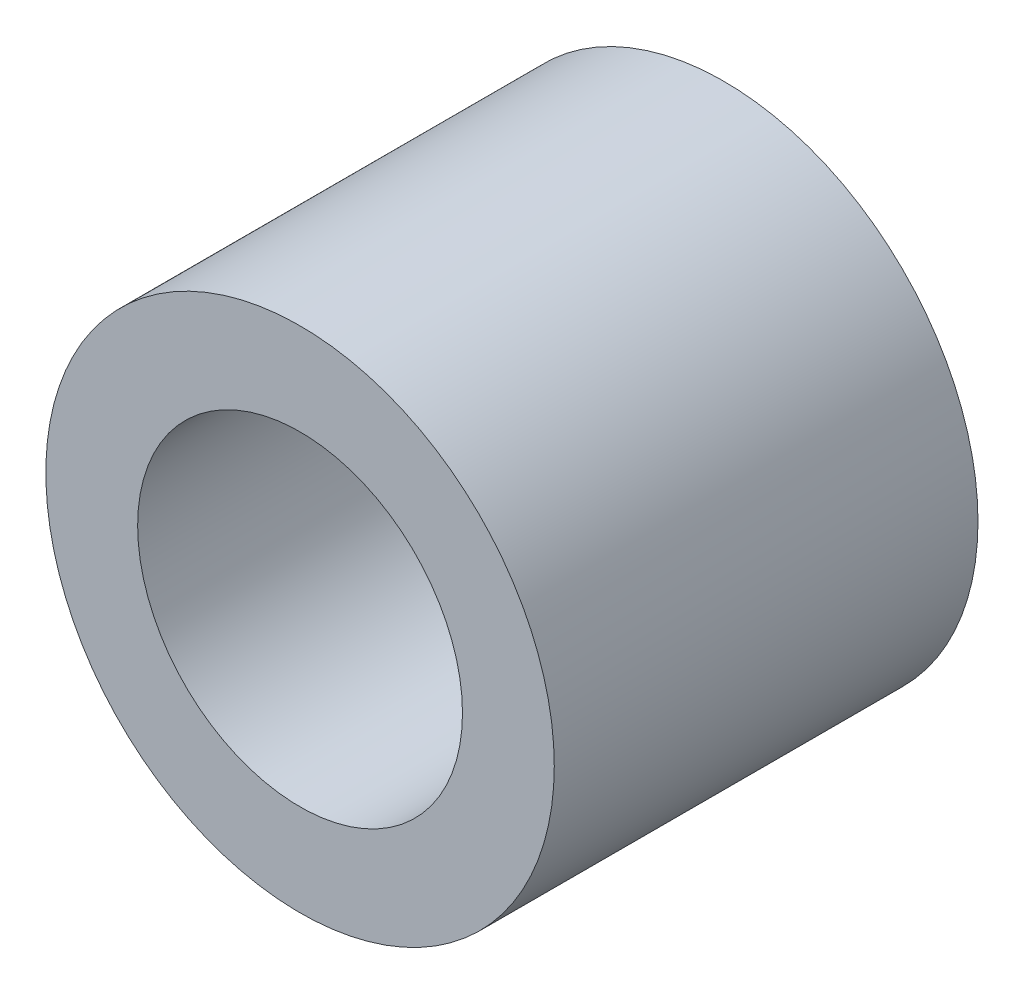
ISO-10303-21;
HEADER;
FILE_DESCRIPTION(('STEP AP214'),'2;1');
FILE_NAME('part.step','',(''),(''),'','','');
FILE_SCHEMA(('AUTOMOTIVE_DESIGN { 1 0 10303 214 1 1 1 1 }'));
ENDSEC;
DATA;
#1=APPLICATION_CONTEXT('core data for automotive mechanical design processes');
#2=APPLICATION_PROTOCOL_DEFINITION('international standard','automotive_design',2000,#1);
#3=PRODUCT_CONTEXT('',#1,'mechanical');
#4=PRODUCT('Part','Part','',(#3));
#5=PRODUCT_RELATED_PRODUCT_CATEGORY('part','',(#4));
#6=PRODUCT_DEFINITION_FORMATION('','',#4);
#7=PRODUCT_DEFINITION_CONTEXT('part definition',#1,'design');
#8=PRODUCT_DEFINITION('design','',#6,#7);
#9=PRODUCT_DEFINITION_SHAPE('','',#8);
#10=(LENGTH_UNIT() NAMED_UNIT(*) SI_UNIT(.MILLI.,.METRE.));
#11=(NAMED_UNIT(*) PLANE_ANGLE_UNIT() SI_UNIT($,.RADIAN.));
#12=(NAMED_UNIT(*) SI_UNIT($,.STERADIAN.) SOLID_ANGLE_UNIT());
#13=UNCERTAINTY_MEASURE_WITH_UNIT(LENGTH_MEASURE(1.E-05),#10,'distance_accuracy_value','');
#14=(GEOMETRIC_REPRESENTATION_CONTEXT(3) GLOBAL_UNCERTAINTY_ASSIGNED_CONTEXT((#13)) GLOBAL_UNIT_ASSIGNED_CONTEXT((#10,
#11,#12)) REPRESENTATION_CONTEXT('',''));
#15=CARTESIAN_POINT('',(0.,0.,0.));
#16=DIRECTION('',(0.,0.,1.));
#17=DIRECTION('',(1.,0.,0.));
#18=AXIS2_PLACEMENT_3D('',#15,#16,#17);
#19=CARTESIAN_POINT('',(0.,0.,6.));
#20=DIRECTION('',(0.,0.,1.));
#21=DIRECTION('',(1.,0.,0.));
#22=AXIS2_PLACEMENT_3D('',#19,#20,#21);
#23=PLANE('',#22);
#24=CARTESIAN_POINT('',(0.,0.,6.));
#25=DIRECTION('',(0.,0.,1.));
#26=DIRECTION('',(1.,0.,0.));
#27=AXIS2_PLACEMENT_3D('',#24,#25,#26);
#28=CIRCLE('',#27,3.6);
#29=CARTESIAN_POINT('',(3.6,0.,6.));
#30=VERTEX_POINT('',#29);
#31=EDGE_CURVE('E10',#30,#30,#28,.T.);
#32=ORIENTED_EDGE('',*,*,#31,.T.);
#33=EDGE_LOOP('',(#32));
#34=FACE_BOUND('',#33,.T.);
#35=CARTESIAN_POINT('',(0.,0.,6.));
#36=DIRECTION('',(0.,0.,1.));
#37=DIRECTION('',(1.,0.,0.));
#38=AXIS2_PLACEMENT_3D('',#35,#36,#37);
#39=CIRCLE('',#38,2.3);
#40=CARTESIAN_POINT('',(2.3,0.,6.));
#41=VERTEX_POINT('',#40);
#42=EDGE_CURVE('E42',#41,#41,#39,.T.);
#43=ORIENTED_EDGE('',*,*,#42,.F.);
#44=EDGE_LOOP('',(#43));
#45=FACE_BOUND('',#44,.T.);
#46=ADVANCED_FACE('F31',(#34,#45),#23,.T.);
#47=CARTESIAN_POINT('',(0.,0.,0.));
#48=DIRECTION('',(0.,0.,1.));
#49=DIRECTION('',(1.,0.,0.));
#50=AXIS2_PLACEMENT_3D('',#47,#48,#49);
#51=PLANE('',#50);
#52=CARTESIAN_POINT('',(0.,0.,0.));
#53=DIRECTION('',(0.,0.,1.));
#54=DIRECTION('',(1.,0.,0.));
#55=AXIS2_PLACEMENT_3D('',#52,#53,#54);
#56=CIRCLE('',#55,3.6);
#57=CARTESIAN_POINT('',(3.6,0.,0.));
#58=VERTEX_POINT('',#57);
#59=EDGE_CURVE('E35',#58,#58,#56,.T.);
#60=ORIENTED_EDGE('',*,*,#59,.F.);
#61=EDGE_LOOP('',(#60));
#62=FACE_BOUND('',#61,.T.);
#63=CARTESIAN_POINT('',(0.,0.,0.));
#64=DIRECTION('',(0.,0.,1.));
#65=DIRECTION('',(1.,0.,0.));
#66=AXIS2_PLACEMENT_3D('',#63,#64,#65);
#67=CIRCLE('',#66,2.3);
#68=CARTESIAN_POINT('',(2.3,0.,0.));
#69=VERTEX_POINT('',#68);
#70=EDGE_CURVE('E44',#69,#69,#67,.T.);
#71=ORIENTED_EDGE('',*,*,#70,.T.);
#72=EDGE_LOOP('',(#71));
#73=FACE_BOUND('',#72,.T.);
#74=ADVANCED_FACE('F54',(#62,#73),#51,.F.);
#75=CARTESIAN_POINT('',(0.,0.,6.));
#76=DIRECTION('',(0.,0.,-1.));
#77=DIRECTION('',(-1.,0.,0.));
#78=AXIS2_PLACEMENT_3D('',#75,#76,#77);
#79=CYLINDRICAL_SURFACE('',#78,3.6);
#80=ORIENTED_EDGE('',*,*,#31,.F.);
#81=EDGE_LOOP('',(#80));
#82=FACE_BOUND('',#81,.T.);
#83=ORIENTED_EDGE('',*,*,#59,.T.);
#84=EDGE_LOOP('',(#83));
#85=FACE_BOUND('',#84,.T.);
#86=ADVANCED_FACE('F33',(#82,#85),#79,.T.);
#87=CARTESIAN_POINT('',(0.,0.,6.));
#88=DIRECTION('',(0.,0.,-1.));
#89=DIRECTION('',(-1.,0.,0.));
#90=AXIS2_PLACEMENT_3D('',#87,#88,#89);
#91=CYLINDRICAL_SURFACE('',#90,2.3);
#92=ORIENTED_EDGE('',*,*,#42,.T.);
#93=EDGE_LOOP('',(#92));
#94=FACE_BOUND('',#93,.T.);
#95=ORIENTED_EDGE('',*,*,#70,.F.);
#96=EDGE_LOOP('',(#95));
#97=FACE_BOUND('',#96,.T.);
#98=ADVANCED_FACE('F50',(#94,#97),#91,.F.);
#99=CLOSED_SHELL('',(#46,#74,#86,#98));
#100=MANIFOLD_SOLID_BREP('B2',#99);
#101=ADVANCED_BREP_SHAPE_REPRESENTATION('',(#18,#100),#14);
#102=SHAPE_DEFINITION_REPRESENTATION(#9,#101);
ENDSEC;
END-ISO-10303-21;
